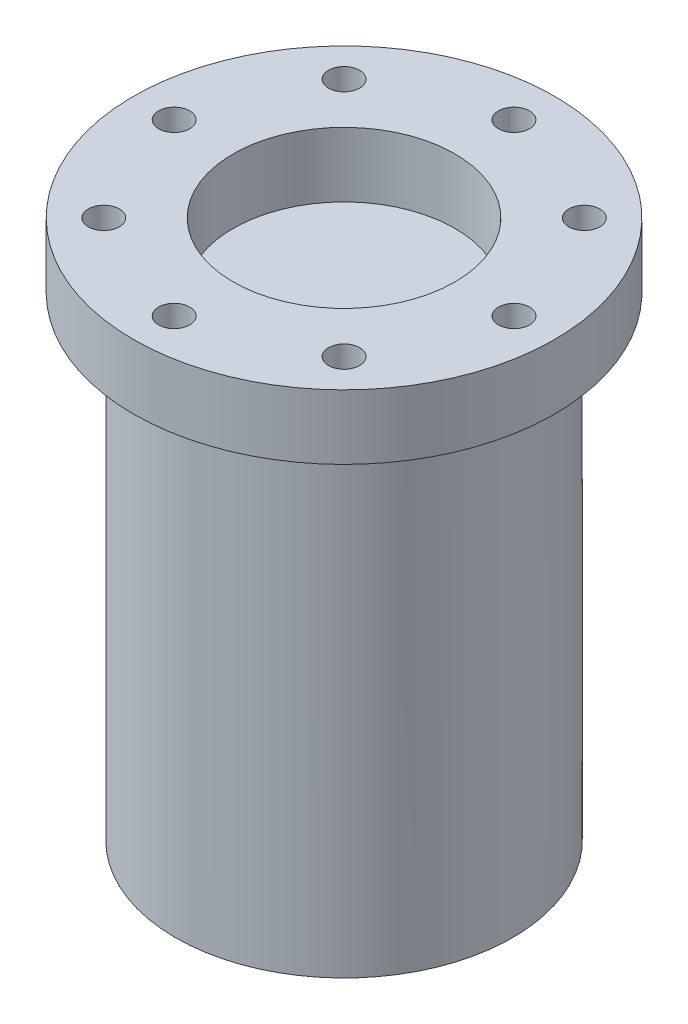
ISO-10303-21;
HEADER;
FILE_DESCRIPTION(('STEP AP214'),'2;1');
FILE_NAME('part.step','',(''),(''),'','','');
FILE_SCHEMA(('AUTOMOTIVE_DESIGN { 1 0 10303 214 1 1 1 1 }'));
ENDSEC;
DATA;
#1=APPLICATION_CONTEXT('core data for automotive mechanical design processes');
#2=APPLICATION_PROTOCOL_DEFINITION('international standard','automotive_design',2000,#1);
#3=PRODUCT_CONTEXT('',#1,'mechanical');
#4=PRODUCT('Part','Part','',(#3));
#5=PRODUCT_RELATED_PRODUCT_CATEGORY('part','',(#4));
#6=PRODUCT_DEFINITION_FORMATION('','',#4);
#7=PRODUCT_DEFINITION_CONTEXT('part definition',#1,'design');
#8=PRODUCT_DEFINITION('design','',#6,#7);
#9=PRODUCT_DEFINITION_SHAPE('','',#8);
#10=(LENGTH_UNIT() NAMED_UNIT(*) SI_UNIT(.MILLI.,.METRE.));
#11=(NAMED_UNIT(*) PLANE_ANGLE_UNIT() SI_UNIT($,.RADIAN.));
#12=(NAMED_UNIT(*) SI_UNIT($,.STERADIAN.) SOLID_ANGLE_UNIT());
#13=UNCERTAINTY_MEASURE_WITH_UNIT(LENGTH_MEASURE(1.E-05),#10,'distance_accuracy_value','');
#14=(GEOMETRIC_REPRESENTATION_CONTEXT(3) GLOBAL_UNCERTAINTY_ASSIGNED_CONTEXT((#13)) GLOBAL_UNIT_ASSIGNED_CONTEXT((#10,
#11,#12)) REPRESENTATION_CONTEXT('',''));
#15=CARTESIAN_POINT('',(0.,0.,0.));
#16=DIRECTION('',(0.,0.,1.));
#17=DIRECTION('',(1.,0.,0.));
#18=AXIS2_PLACEMENT_3D('',#15,#16,#17);
#19=CARTESIAN_POINT('',(0.,0.,0.));
#20=DIRECTION('',(0.,1.,0.));
#21=DIRECTION('',(0.,0.,1.));
#22=AXIS2_PLACEMENT_3D('',#19,#20,#21);
#23=PLANE('',#22);
#24=CARTESIAN_POINT('',(0.,0.,0.));
#25=DIRECTION('',(0.,1.,0.));
#26=DIRECTION('',(0.,0.,1.));
#27=AXIS2_PLACEMENT_3D('',#24,#25,#26);
#28=CIRCLE('',#27,57.15);
#29=CARTESIAN_POINT('',(0.,0.,57.15));
#30=VERTEX_POINT('',#29);
#31=EDGE_CURVE('E40',#30,#30,#28,.T.);
#32=ORIENTED_EDGE('',*,*,#31,.F.);
#33=EDGE_LOOP('',(#32));
#34=FACE_BOUND('',#33,.T.);
#35=CARTESIAN_POINT('',(0.,0.,0.));
#36=DIRECTION('',(0.,-1.,0.));
#37=DIRECTION('',(0.,0.,-1.));
#38=AXIS2_PLACEMENT_3D('',#35,#36,#37);
#39=CIRCLE('',#38,45.72);
#40=CARTESIAN_POINT('',(4.17738774686261,0.,-45.528758292011));
#41=VERTEX_POINT('',#40);
#42=CARTESIAN_POINT('',(29.2398345238317,0.,-35.1475529307367));
#43=VERTEX_POINT('',#42);
#44=EDGE_CURVE('E108',#41,#43,#39,.T.);
#45=ORIENTED_EDGE('',*,*,#44,.F.);
#46=CARTESIAN_POINT('',(0.,0.,-46.101));
#47=DIRECTION('',(0.,1.,0.));
#48=DIRECTION('',(0.,0.,1.));
#49=AXIS2_PLACEMENT_3D('',#46,#47,#48);
#50=CIRCLE('',#49,4.2164);
#51=CARTESIAN_POINT('',(-4.17738774686261,0.,-45.528758292011));
#52=VERTEX_POINT('',#51);
#53=EDGE_CURVE('E101',#41,#52,#50,.T.);
#54=ORIENTED_EDGE('',*,*,#53,.T.);
#55=CARTESIAN_POINT('',(-29.2398345238322,0.,-35.1475529307363));
#56=VERTEX_POINT('',#55);
#57=EDGE_CURVE('E105',#56,#52,#39,.T.);
#58=ORIENTED_EDGE('',*,*,#57,.F.);
#59=CARTESIAN_POINT('',(-32.5983297194811,0.,-32.598329719481));
#60=DIRECTION('',(0.,1.,0.));
#61=DIRECTION('',(0.707106781186549,0.,0.707106781186546));
#62=AXIS2_PLACEMENT_3D('',#59,#60,#61);
#63=CIRCLE('',#62,4.2164);
#64=CARTESIAN_POINT('',(-35.1475529307364,0.,-29.239834523832));
#65=VERTEX_POINT('',#64);
#66=EDGE_CURVE('E175',#56,#65,#63,.T.);
#67=ORIENTED_EDGE('',*,*,#66,.T.);
#68=CARTESIAN_POINT('',(-45.528758292011,0.,-4.17738774686245));
#69=VERTEX_POINT('',#68);
#70=EDGE_CURVE('E127',#69,#65,#39,.T.);
#71=ORIENTED_EDGE('',*,*,#70,.F.);
#72=CARTESIAN_POINT('',(-46.101,0.,1.60960781202007E-13));
#73=DIRECTION('',(0.,1.,0.));
#74=DIRECTION('',(1.,0.,0.));
#75=AXIS2_PLACEMENT_3D('',#72,#73,#74);
#76=CIRCLE('',#75,4.2164);
#77=CARTESIAN_POINT('',(-45.528758292011,0.,4.17738774686277));
#78=VERTEX_POINT('',#77);
#79=EDGE_CURVE('E163',#69,#78,#76,.T.);
#80=ORIENTED_EDGE('',*,*,#79,.T.);
#81=CARTESIAN_POINT('',(-35.1475529307362,0.,29.2398345238323));
#82=VERTEX_POINT('',#81);
#83=EDGE_CURVE('E129',#82,#78,#39,.T.);
#84=ORIENTED_EDGE('',*,*,#83,.F.);
#85=CARTESIAN_POINT('',(-32.5983297194809,0.,32.5983297194812));
#86=DIRECTION('',(0.,1.,0.));
#87=DIRECTION('',(0.707106781186544,0.,-0.707106781186551));
#88=AXIS2_PLACEMENT_3D('',#85,#86,#87);
#89=CIRCLE('',#88,4.2164);
#90=CARTESIAN_POINT('',(-29.2398345238319,0.,35.1475529307365));
#91=VERTEX_POINT('',#90);
#92=EDGE_CURVE('E168',#82,#91,#89,.T.);
#93=ORIENTED_EDGE('',*,*,#92,.T.);
#94=CARTESIAN_POINT('',(-4.17738774686229,0.,45.528758292011));
#95=VERTEX_POINT('',#94);
#96=EDGE_CURVE('E292',#95,#91,#39,.T.);
#97=ORIENTED_EDGE('',*,*,#96,.F.);
#98=CARTESIAN_POINT('',(3.21921562404015E-13,0.,46.101));
#99=DIRECTION('',(0.,1.,0.));
#100=DIRECTION('',(0.,0.,-1.));
#101=AXIS2_PLACEMENT_3D('',#98,#99,#100);
#102=CIRCLE('',#101,4.2164);
#103=CARTESIAN_POINT('',(4.17738774686292,0.,45.528758292011));
#104=VERTEX_POINT('',#103);
#105=EDGE_CURVE('E259',#95,#104,#102,.T.);
#106=ORIENTED_EDGE('',*,*,#105,.T.);
#107=CARTESIAN_POINT('',(29.2398345238324,0.,35.1475529307361));
#108=VERTEX_POINT('',#107);
#109=EDGE_CURVE('E293',#108,#104,#39,.T.);
#110=ORIENTED_EDGE('',*,*,#109,.F.);
#111=CARTESIAN_POINT('',(32.5983297194813,0.,32.5983297194807));
#112=DIRECTION('',(0.,1.,0.));
#113=DIRECTION('',(-0.707106781186554,0.,-0.707106781186541));
#114=AXIS2_PLACEMENT_3D('',#111,#112,#113);
#115=CIRCLE('',#114,4.2164);
#116=CARTESIAN_POINT('',(35.1475529307366,0.,29.2398345238318));
#117=VERTEX_POINT('',#116);
#118=EDGE_CURVE('E254',#108,#117,#115,.T.);
#119=ORIENTED_EDGE('',*,*,#118,.T.);
#120=CARTESIAN_POINT('',(45.5287582920111,0.,4.17738774686213));
#121=VERTEX_POINT('',#120);
#122=EDGE_CURVE('E45',#121,#117,#39,.T.);
#123=ORIENTED_EDGE('',*,*,#122,.F.);
#124=CARTESIAN_POINT('',(46.101,0.,-4.82882343606022E-13));
#125=DIRECTION('',(0.,1.,0.));
#126=DIRECTION('',(-1.,0.,0.));
#127=AXIS2_PLACEMENT_3D('',#124,#125,#126);
#128=CIRCLE('',#127,4.2164);
#129=CARTESIAN_POINT('',(45.528758292011,0.,-4.17738774686308));
#130=VERTEX_POINT('',#129);
#131=EDGE_CURVE('E246',#121,#130,#128,.T.);
#132=ORIENTED_EDGE('',*,*,#131,.T.);
#133=CARTESIAN_POINT('',(35.147552930736,0.,-29.2398345238325));
#134=VERTEX_POINT('',#133);
#135=EDGE_CURVE('E12',#134,#130,#39,.T.);
#136=ORIENTED_EDGE('',*,*,#135,.F.);
#137=CARTESIAN_POINT('',(32.5983297194806,0.,-32.5983297194814));
#138=DIRECTION('',(0.,1.,0.));
#139=DIRECTION('',(-0.707106781186539,0.,0.707106781186556));
#140=AXIS2_PLACEMENT_3D('',#137,#138,#139);
#141=CIRCLE('',#140,4.2164);
#142=EDGE_CURVE('E244',#134,#43,#141,.T.);
#143=ORIENTED_EDGE('',*,*,#142,.T.);
#144=EDGE_LOOP('',(#45,#54,#58,#67,#71,#80,#84,#93,#97,#106,#110,#119,#123,#132,#136,#143));
#145=FACE_BOUND('',#144,.T.);
#146=ADVANCED_FACE('F36',(#34,#145),#23,.F.);
#147=CARTESIAN_POINT('',(0.,17.526,0.));
#148=DIRECTION('',(0.,1.,0.));
#149=DIRECTION('',(0.,0.,1.));
#150=AXIS2_PLACEMENT_3D('',#147,#148,#149);
#151=PLANE('',#150);
#152=CARTESIAN_POINT('',(46.101,17.526,-4.82882343606022E-13));
#153=DIRECTION('',(0.,1.,0.));
#154=DIRECTION('',(-1.,0.,0.));
#155=AXIS2_PLACEMENT_3D('',#152,#153,#154);
#156=CIRCLE('',#155,4.2164);
#157=CARTESIAN_POINT('',(41.8846,17.526,-4.38717897854727E-13));
#158=VERTEX_POINT('',#157);
#159=EDGE_CURVE('E217',#158,#158,#156,.T.);
#160=ORIENTED_EDGE('',*,*,#159,.F.);
#161=EDGE_LOOP('',(#160));
#162=FACE_BOUND('',#161,.T.);
#163=CARTESIAN_POINT('',(3.21921562404015E-13,17.526,46.101));
#164=DIRECTION('',(0.,1.,0.));
#165=DIRECTION('',(0.,0.,-1.));
#166=AXIS2_PLACEMENT_3D('',#163,#164,#165);
#167=CIRCLE('',#166,4.2164);
#168=CARTESIAN_POINT('',(2.92478598569818E-13,17.526,41.8846));
#169=VERTEX_POINT('',#168);
#170=EDGE_CURVE('E221',#169,#169,#167,.T.);
#171=ORIENTED_EDGE('',*,*,#170,.F.);
#172=EDGE_LOOP('',(#171));
#173=FACE_BOUND('',#172,.T.);
#174=CARTESIAN_POINT('',(-46.101,17.526,1.60960781202007E-13));
#175=DIRECTION('',(0.,1.,0.));
#176=DIRECTION('',(1.,0.,0.));
#177=AXIS2_PLACEMENT_3D('',#174,#175,#176);
#178=CIRCLE('',#177,4.2164);
#179=CARTESIAN_POINT('',(-41.8846,17.526,1.46239299284909E-13));
#180=VERTEX_POINT('',#179);
#181=EDGE_CURVE('E166',#180,#180,#178,.T.);
#182=ORIENTED_EDGE('',*,*,#181,.F.);
#183=EDGE_LOOP('',(#182));
#184=FACE_BOUND('',#183,.T.);
#185=CARTESIAN_POINT('',(0.,17.526,-46.101));
#186=DIRECTION('',(0.,1.,0.));
#187=DIRECTION('',(0.,0.,1.));
#188=AXIS2_PLACEMENT_3D('',#185,#186,#187);
#189=CIRCLE('',#188,4.2164);
#190=CARTESIAN_POINT('',(0.,17.526,-41.8846));
#191=VERTEX_POINT('',#190);
#192=EDGE_CURVE('E111',#191,#191,#189,.T.);
#193=ORIENTED_EDGE('',*,*,#192,.F.);
#194=EDGE_LOOP('',(#193));
#195=FACE_BOUND('',#194,.T.);
#196=CARTESIAN_POINT('',(0.,17.526,0.));
#197=DIRECTION('',(0.,1.,0.));
#198=DIRECTION('',(0.,0.,1.));
#199=AXIS2_PLACEMENT_3D('',#196,#197,#198);
#200=CIRCLE('',#199,57.15);
#201=CARTESIAN_POINT('',(0.,17.526,57.15));
#202=VERTEX_POINT('',#201);
#203=EDGE_CURVE('E128',#202,#202,#200,.T.);
#204=ORIENTED_EDGE('',*,*,#203,.T.);
#205=EDGE_LOOP('',(#204));
#206=FACE_BOUND('',#205,.T.);
#207=CARTESIAN_POINT('',(0.,17.526,0.));
#208=DIRECTION('',(0.,1.,0.));
#209=DIRECTION('',(1.,0.,0.));
#210=AXIS2_PLACEMENT_3D('',#207,#208,#209);
#211=CIRCLE('',#210,30.099);
#212=CARTESIAN_POINT('',(30.099,17.526,0.));
#213=VERTEX_POINT('',#212);
#214=EDGE_CURVE('E181',#213,#213,#211,.T.);
#215=ORIENTED_EDGE('',*,*,#214,.F.);
#216=EDGE_LOOP('',(#215));
#217=FACE_BOUND('',#216,.T.);
#218=CARTESIAN_POINT('',(-32.5983297194811,17.526,-32.598329719481));
#219=DIRECTION('',(0.,1.,0.));
#220=DIRECTION('',(0.707106781186549,0.,0.707106781186546));
#221=AXIS2_PLACEMENT_3D('',#218,#219,#220);
#222=CIRCLE('',#221,4.2164);
#223=CARTESIAN_POINT('',(-29.6168846872861,17.526,-29.616884687286));
#224=VERTEX_POINT('',#223);
#225=EDGE_CURVE('E118',#224,#224,#222,.T.);
#226=ORIENTED_EDGE('',*,*,#225,.F.);
#227=EDGE_LOOP('',(#226));
#228=FACE_BOUND('',#227,.T.);
#229=CARTESIAN_POINT('',(-32.5983297194809,17.526,32.5983297194812));
#230=DIRECTION('',(0.,1.,0.));
#231=DIRECTION('',(0.707106781186544,0.,-0.707106781186551));
#232=AXIS2_PLACEMENT_3D('',#229,#230,#231);
#233=CIRCLE('',#232,4.2164);
#234=CARTESIAN_POINT('',(-29.6168846872859,17.526,29.6168846872862));
#235=VERTEX_POINT('',#234);
#236=EDGE_CURVE('E164',#235,#235,#233,.T.);
#237=ORIENTED_EDGE('',*,*,#236,.F.);
#238=EDGE_LOOP('',(#237));
#239=FACE_BOUND('',#238,.T.);
#240=CARTESIAN_POINT('',(32.5983297194813,17.526,32.5983297194807));
#241=DIRECTION('',(0.,1.,0.));
#242=DIRECTION('',(-0.707106781186554,0.,-0.707106781186541));
#243=AXIS2_PLACEMENT_3D('',#240,#241,#242);
#244=CIRCLE('',#243,4.2164);
#245=CARTESIAN_POINT('',(29.6168846872863,17.526,29.6168846872858));
#246=VERTEX_POINT('',#245);
#247=EDGE_CURVE('E238',#246,#246,#244,.T.);
#248=ORIENTED_EDGE('',*,*,#247,.F.);
#249=EDGE_LOOP('',(#248));
#250=FACE_BOUND('',#249,.T.);
#251=CARTESIAN_POINT('',(32.5983297194806,17.526,-32.5983297194814));
#252=DIRECTION('',(0.,1.,0.));
#253=DIRECTION('',(-0.707106781186539,0.,0.707106781186556));
#254=AXIS2_PLACEMENT_3D('',#251,#252,#253);
#255=CIRCLE('',#254,4.2164);
#256=CARTESIAN_POINT('',(29.6168846872857,17.526,-29.6168846872864));
#257=VERTEX_POINT('',#256);
#258=EDGE_CURVE('E241',#257,#257,#255,.T.);
#259=ORIENTED_EDGE('',*,*,#258,.F.);
#260=EDGE_LOOP('',(#259));
#261=FACE_BOUND('',#260,.T.);
#262=ADVANCED_FACE('F200',(#162,#173,#184,#195,#206,#217,#228,#239,#250,#261),#151,.T.);
#263=CARTESIAN_POINT('',(0.,17.526,0.));
#264=DIRECTION('',(0.,-1.,0.));
#265=DIRECTION('',(0.,0.,-1.));
#266=AXIS2_PLACEMENT_3D('',#263,#264,#265);
#267=CYLINDRICAL_SURFACE('',#266,57.15);
#268=ORIENTED_EDGE('',*,*,#203,.F.);
#269=EDGE_LOOP('',(#268));
#270=FACE_BOUND('',#269,.T.);
#271=ORIENTED_EDGE('',*,*,#31,.T.);
#272=EDGE_LOOP('',(#271));
#273=FACE_BOUND('',#272,.T.);
#274=ADVANCED_FACE('F38',(#270,#273),#267,.T.);
#275=CARTESIAN_POINT('',(0.,17.526,0.));
#276=DIRECTION('',(0.,-1.,0.));
#277=DIRECTION('',(0.,0.,-1.));
#278=AXIS2_PLACEMENT_3D('',#275,#276,#277);
#279=CYLINDRICAL_SURFACE('',#278,30.099);
#280=ORIENTED_EDGE('',*,*,#214,.T.);
#281=EDGE_LOOP('',(#280));
#282=FACE_BOUND('',#281,.T.);
#283=CARTESIAN_POINT('',(0.,0.,0.));
#284=DIRECTION('',(0.,1.,0.));
#285=DIRECTION('',(1.,0.,0.));
#286=AXIS2_PLACEMENT_3D('',#283,#284,#285);
#287=CIRCLE('',#286,30.099);
#288=CARTESIAN_POINT('',(30.099,0.,0.));
#289=VERTEX_POINT('',#288);
#290=EDGE_CURVE('E179',#289,#289,#287,.T.);
#291=ORIENTED_EDGE('',*,*,#290,.F.);
#292=EDGE_LOOP('',(#291));
#293=FACE_BOUND('',#292,.T.);
#294=ADVANCED_FACE('F189',(#282,#293),#279,.F.);
#295=CARTESIAN_POINT('',(0.,17.526,-46.101));
#296=DIRECTION('',(0.,-1.,0.));
#297=DIRECTION('',(0.,0.,-1.));
#298=AXIS2_PLACEMENT_3D('',#295,#296,#297);
#299=CYLINDRICAL_SURFACE('',#298,4.2164);
#300=ORIENTED_EDGE('',*,*,#192,.T.);
#301=EDGE_LOOP('',(#300));
#302=FACE_BOUND('',#301,.T.);
#303=ORIENTED_EDGE('',*,*,#53,.F.);
#304=EDGE_CURVE('E112',#52,#41,#50,.T.);
#305=ORIENTED_EDGE('',*,*,#304,.F.);
#306=EDGE_LOOP('',(#303,#305));
#307=FACE_BOUND('',#306,.T.);
#308=ADVANCED_FACE('F115',(#302,#307),#299,.F.);
#309=CARTESIAN_POINT('',(-32.5983297194811,17.526,-32.598329719481));
#310=DIRECTION('',(0.,-1.,0.));
#311=DIRECTION('',(0.,0.,-1.));
#312=AXIS2_PLACEMENT_3D('',#309,#310,#311);
#313=CYLINDRICAL_SURFACE('',#312,4.2164);
#314=ORIENTED_EDGE('',*,*,#225,.T.);
#315=EDGE_LOOP('',(#314));
#316=FACE_BOUND('',#315,.T.);
#317=ORIENTED_EDGE('',*,*,#66,.F.);
#318=EDGE_CURVE('E177',#65,#56,#63,.T.);
#319=ORIENTED_EDGE('',*,*,#318,.F.);
#320=EDGE_LOOP('',(#317,#319));
#321=FACE_BOUND('',#320,.T.);
#322=ADVANCED_FACE('F197',(#316,#321),#313,.F.);
#323=CARTESIAN_POINT('',(-46.101,17.526,1.60960781202007E-13));
#324=DIRECTION('',(0.,-1.,0.));
#325=DIRECTION('',(0.,0.,-1.));
#326=AXIS2_PLACEMENT_3D('',#323,#324,#325);
#327=CYLINDRICAL_SURFACE('',#326,4.2164);
#328=ORIENTED_EDGE('',*,*,#181,.T.);
#329=EDGE_LOOP('',(#328));
#330=FACE_BOUND('',#329,.T.);
#331=ORIENTED_EDGE('',*,*,#79,.F.);
#332=EDGE_CURVE('E159',#78,#69,#76,.T.);
#333=ORIENTED_EDGE('',*,*,#332,.F.);
#334=EDGE_LOOP('',(#331,#333));
#335=FACE_BOUND('',#334,.T.);
#336=ADVANCED_FACE('F270',(#330,#335),#327,.F.);
#337=CARTESIAN_POINT('',(-32.5983297194809,17.526,32.5983297194812));
#338=DIRECTION('',(0.,-1.,0.));
#339=DIRECTION('',(0.,0.,-1.));
#340=AXIS2_PLACEMENT_3D('',#337,#338,#339);
#341=CYLINDRICAL_SURFACE('',#340,4.2164);
#342=ORIENTED_EDGE('',*,*,#236,.T.);
#343=EDGE_LOOP('',(#342));
#344=FACE_BOUND('',#343,.T.);
#345=ORIENTED_EDGE('',*,*,#92,.F.);
#346=EDGE_CURVE('E258',#91,#82,#89,.T.);
#347=ORIENTED_EDGE('',*,*,#346,.F.);
#348=EDGE_LOOP('',(#345,#347));
#349=FACE_BOUND('',#348,.T.);
#350=ADVANCED_FACE('F267',(#344,#349),#341,.F.);
#351=CARTESIAN_POINT('',(3.21921562404015E-13,17.526,46.101));
#352=DIRECTION('',(0.,-1.,0.));
#353=DIRECTION('',(0.,0.,-1.));
#354=AXIS2_PLACEMENT_3D('',#351,#352,#353);
#355=CYLINDRICAL_SURFACE('',#354,4.2164);
#356=ORIENTED_EDGE('',*,*,#170,.T.);
#357=EDGE_LOOP('',(#356));
#358=FACE_BOUND('',#357,.T.);
#359=ORIENTED_EDGE('',*,*,#105,.F.);
#360=EDGE_CURVE('E253',#104,#95,#102,.T.);
#361=ORIENTED_EDGE('',*,*,#360,.F.);
#362=EDGE_LOOP('',(#359,#361));
#363=FACE_BOUND('',#362,.T.);
#364=ADVANCED_FACE('F269',(#358,#363),#355,.F.);
#365=CARTESIAN_POINT('',(32.5983297194813,17.526,32.5983297194807));
#366=DIRECTION('',(0.,-1.,0.));
#367=DIRECTION('',(0.,0.,-1.));
#368=AXIS2_PLACEMENT_3D('',#365,#366,#367);
#369=CYLINDRICAL_SURFACE('',#368,4.2164);
#370=ORIENTED_EDGE('',*,*,#247,.T.);
#371=EDGE_LOOP('',(#370));
#372=FACE_BOUND('',#371,.T.);
#373=ORIENTED_EDGE('',*,*,#118,.F.);
#374=EDGE_CURVE('E250',#117,#108,#115,.T.);
#375=ORIENTED_EDGE('',*,*,#374,.F.);
#376=EDGE_LOOP('',(#373,#375));
#377=FACE_BOUND('',#376,.T.);
#378=ADVANCED_FACE('F277',(#372,#377),#369,.F.);
#379=CARTESIAN_POINT('',(46.101,17.526,-4.82882343606022E-13));
#380=DIRECTION('',(0.,-1.,0.));
#381=DIRECTION('',(0.,0.,-1.));
#382=AXIS2_PLACEMENT_3D('',#379,#380,#381);
#383=CYLINDRICAL_SURFACE('',#382,4.2164);
#384=ORIENTED_EDGE('',*,*,#159,.T.);
#385=EDGE_LOOP('',(#384));
#386=FACE_BOUND('',#385,.T.);
#387=ORIENTED_EDGE('',*,*,#131,.F.);
#388=EDGE_CURVE('E243',#130,#121,#128,.T.);
#389=ORIENTED_EDGE('',*,*,#388,.F.);
#390=EDGE_LOOP('',(#387,#389));
#391=FACE_BOUND('',#390,.T.);
#392=ADVANCED_FACE('F297',(#386,#391),#383,.F.);
#393=CARTESIAN_POINT('',(32.5983297194806,17.526,-32.5983297194814));
#394=DIRECTION('',(0.,-1.,0.));
#395=DIRECTION('',(0.,0.,-1.));
#396=AXIS2_PLACEMENT_3D('',#393,#394,#395);
#397=CYLINDRICAL_SURFACE('',#396,4.2164);
#398=ORIENTED_EDGE('',*,*,#258,.T.);
#399=EDGE_LOOP('',(#398));
#400=FACE_BOUND('',#399,.T.);
#401=ORIENTED_EDGE('',*,*,#142,.F.);
#402=EDGE_CURVE('E53',#43,#134,#141,.T.);
#403=ORIENTED_EDGE('',*,*,#402,.F.);
#404=EDGE_LOOP('',(#401,#403));
#405=FACE_BOUND('',#404,.T.);
#406=ADVANCED_FACE('F324',(#400,#405),#397,.F.);
#407=CARTESIAN_POINT('',(0.,-128.778,0.));
#408=DIRECTION('',(0.,-1.,0.));
#409=DIRECTION('',(0.,0.,-1.));
#410=AXIS2_PLACEMENT_3D('',#407,#408,#409);
#411=PLANE('',#410);
#412=CARTESIAN_POINT('',(0.,-128.778,0.));
#413=DIRECTION('',(0.,-1.,0.));
#414=DIRECTION('',(0.,0.,-1.));
#415=AXIS2_PLACEMENT_3D('',#412,#413,#414);
#416=CIRCLE('',#415,45.72);
#417=CARTESIAN_POINT('',(0.,-128.778,-45.72));
#418=VERTEX_POINT('',#417);
#419=EDGE_CURVE('E133',#418,#418,#416,.T.);
#420=ORIENTED_EDGE('',*,*,#419,.T.);
#421=EDGE_LOOP('',(#420));
#422=FACE_BOUND('',#421,.T.);
#423=ADVANCED_FACE('F319',(#422),#411,.T.);
#424=CARTESIAN_POINT('',(0.,-128.778,0.));
#425=DIRECTION('',(0.,1.,0.));
#426=DIRECTION('',(0.,0.,1.));
#427=AXIS2_PLACEMENT_3D('',#424,#425,#426);
#428=CYLINDRICAL_SURFACE('',#427,45.72);
#429=ORIENTED_EDGE('',*,*,#419,.F.);
#430=EDGE_LOOP('',(#429));
#431=FACE_BOUND('',#430,.T.);
#432=ORIENTED_EDGE('',*,*,#44,.T.);
#433=EDGE_CURVE('E47',#43,#134,#39,.T.);
#434=ORIENTED_EDGE('',*,*,#433,.T.);
#435=ORIENTED_EDGE('',*,*,#135,.T.);
#436=EDGE_CURVE('E136',#130,#121,#39,.T.);
#437=ORIENTED_EDGE('',*,*,#436,.T.);
#438=ORIENTED_EDGE('',*,*,#122,.T.);
#439=EDGE_CURVE('E139',#117,#108,#39,.T.);
#440=ORIENTED_EDGE('',*,*,#439,.T.);
#441=ORIENTED_EDGE('',*,*,#109,.T.);
#442=EDGE_CURVE('E143',#104,#95,#39,.T.);
#443=ORIENTED_EDGE('',*,*,#442,.T.);
#444=ORIENTED_EDGE('',*,*,#96,.T.);
#445=EDGE_CURVE('E147',#91,#82,#39,.T.);
#446=ORIENTED_EDGE('',*,*,#445,.T.);
#447=ORIENTED_EDGE('',*,*,#83,.T.);
#448=EDGE_CURVE('E151',#78,#69,#39,.T.);
#449=ORIENTED_EDGE('',*,*,#448,.T.);
#450=ORIENTED_EDGE('',*,*,#70,.T.);
#451=EDGE_CURVE('E122',#65,#56,#39,.T.);
#452=ORIENTED_EDGE('',*,*,#451,.T.);
#453=ORIENTED_EDGE('',*,*,#57,.T.);
#454=EDGE_CURVE('E119',#52,#41,#39,.T.);
#455=ORIENTED_EDGE('',*,*,#454,.T.);
#456=EDGE_LOOP('',(#432,#434,#435,#437,#438,#440,#441,#443,#444,#446,#447,#449,#450,#452,#453,#455));
#457=FACE_BOUND('',#456,.T.);
#458=ADVANCED_FACE('F124',(#431,#457),#428,.T.);
#459=CARTESIAN_POINT('',(0.,0.,0.));
#460=DIRECTION('',(0.,-1.,0.));
#461=DIRECTION('',(0.,0.,-1.));
#462=AXIS2_PLACEMENT_3D('',#459,#460,#461);
#463=PLANE('',#462);
#464=ORIENTED_EDGE('',*,*,#433,.F.);
#465=ORIENTED_EDGE('',*,*,#402,.T.);
#466=EDGE_LOOP('',(#464,#465));
#467=FACE_BOUND('',#466,.T.);
#468=ADVANCED_FACE('F303',(#467),#463,.F.);
#469=ORIENTED_EDGE('',*,*,#439,.F.);
#470=ORIENTED_EDGE('',*,*,#374,.T.);
#471=EDGE_LOOP('',(#469,#470));
#472=FACE_BOUND('',#471,.T.);
#473=ADVANCED_FACE('F312',(#472),#463,.F.);
#474=ORIENTED_EDGE('',*,*,#445,.F.);
#475=ORIENTED_EDGE('',*,*,#346,.T.);
#476=EDGE_LOOP('',(#474,#475));
#477=FACE_BOUND('',#476,.T.);
#478=ADVANCED_FACE('F265',(#477),#463,.F.);
#479=ORIENTED_EDGE('',*,*,#451,.F.);
#480=ORIENTED_EDGE('',*,*,#318,.T.);
#481=EDGE_LOOP('',(#479,#480));
#482=FACE_BOUND('',#481,.T.);
#483=ADVANCED_FACE('F291',(#482),#463,.F.);
#484=ORIENTED_EDGE('',*,*,#454,.F.);
#485=ORIENTED_EDGE('',*,*,#304,.T.);
#486=EDGE_LOOP('',(#484,#485));
#487=FACE_BOUND('',#486,.T.);
#488=ADVANCED_FACE('F120',(#487),#463,.F.);
#489=ORIENTED_EDGE('',*,*,#448,.F.);
#490=ORIENTED_EDGE('',*,*,#332,.T.);
#491=EDGE_LOOP('',(#489,#490));
#492=FACE_BOUND('',#491,.T.);
#493=ADVANCED_FACE('F158',(#492),#463,.F.);
#494=ORIENTED_EDGE('',*,*,#442,.F.);
#495=ORIENTED_EDGE('',*,*,#360,.T.);
#496=EDGE_LOOP('',(#494,#495));
#497=FACE_BOUND('',#496,.T.);
#498=ADVANCED_FACE('F301',(#497),#463,.F.);
#499=ORIENTED_EDGE('',*,*,#436,.F.);
#500=ORIENTED_EDGE('',*,*,#388,.T.);
#501=EDGE_LOOP('',(#499,#500));
#502=FACE_BOUND('',#501,.T.);
#503=ADVANCED_FACE('F299',(#502),#463,.F.);
#504=ORIENTED_EDGE('',*,*,#290,.T.);
#505=EDGE_LOOP('',(#504));
#506=FACE_BOUND('',#505,.T.);
#507=ADVANCED_FACE('F187',(#506),#463,.F.);
#508=CLOSED_SHELL('',(#146,#262,#274,#294,#308,#322,#336,#350,#364,#378,#392,#406,#423,#458,
#468,#473,#478,#483,#488,#493,#498,#503,#507));
#509=MANIFOLD_SOLID_BREP('B2',#508);
#510=ADVANCED_BREP_SHAPE_REPRESENTATION('',(#18,#509),#14);
#511=SHAPE_DEFINITION_REPRESENTATION(#9,#510);
ENDSEC;
END-ISO-10303-21;
